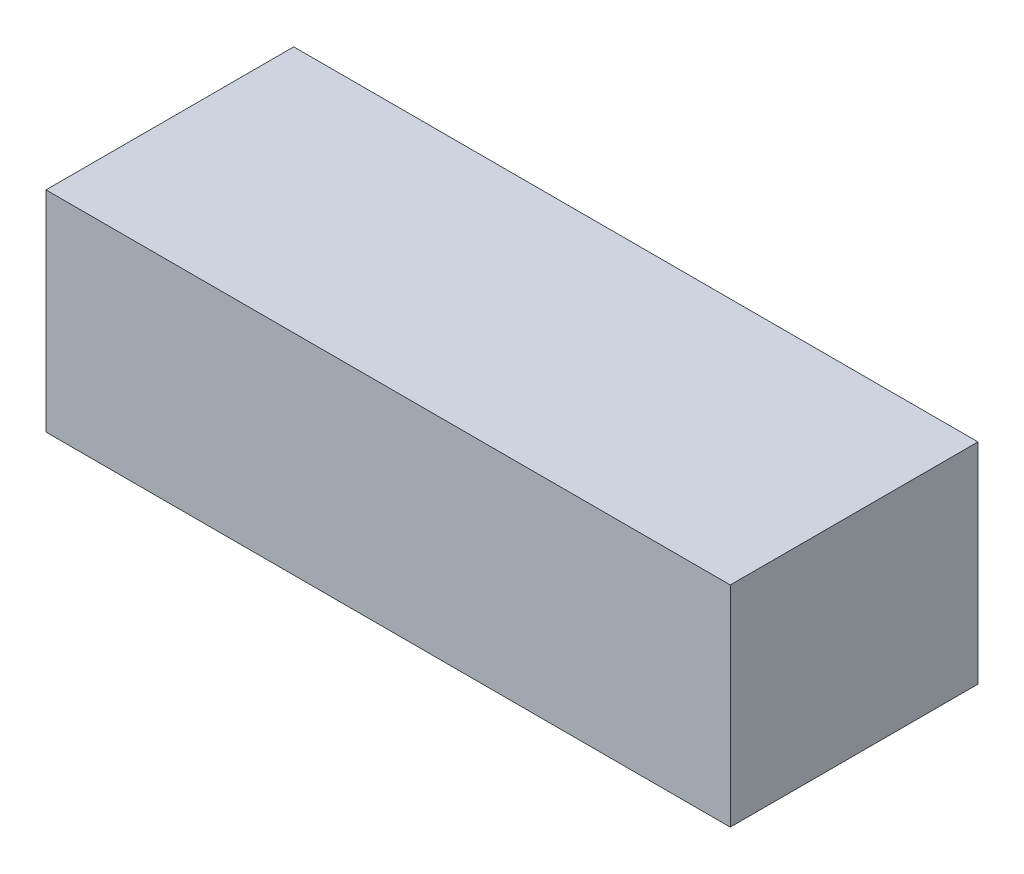
ISO-10303-21;
HEADER;
FILE_DESCRIPTION(('STEP AP214'),'2;1');
FILE_NAME('part.step','',(''),(''),'','','');
FILE_SCHEMA(('AUTOMOTIVE_DESIGN { 1 0 10303 214 1 1 1 1 }'));
ENDSEC;
DATA;
#1=APPLICATION_CONTEXT('core data for automotive mechanical design processes');
#2=APPLICATION_PROTOCOL_DEFINITION('international standard','automotive_design',2000,#1);
#3=PRODUCT_CONTEXT('',#1,'mechanical');
#4=PRODUCT('Part','Part','',(#3));
#5=PRODUCT_RELATED_PRODUCT_CATEGORY('part','',(#4));
#6=PRODUCT_DEFINITION_FORMATION('','',#4);
#7=PRODUCT_DEFINITION_CONTEXT('part definition',#1,'design');
#8=PRODUCT_DEFINITION('design','',#6,#7);
#9=PRODUCT_DEFINITION_SHAPE('','',#8);
#10=(LENGTH_UNIT() NAMED_UNIT(*) SI_UNIT(.MILLI.,.METRE.));
#11=(NAMED_UNIT(*) PLANE_ANGLE_UNIT() SI_UNIT($,.RADIAN.));
#12=(NAMED_UNIT(*) SI_UNIT($,.STERADIAN.) SOLID_ANGLE_UNIT());
#13=UNCERTAINTY_MEASURE_WITH_UNIT(LENGTH_MEASURE(1.E-05),#10,'distance_accuracy_value','');
#14=(GEOMETRIC_REPRESENTATION_CONTEXT(3) GLOBAL_UNCERTAINTY_ASSIGNED_CONTEXT((#13)) GLOBAL_UNIT_ASSIGNED_CONTEXT((#10,
#11,#12)) REPRESENTATION_CONTEXT('',''));
#15=CARTESIAN_POINT('',(0.,0.,0.));
#16=DIRECTION('',(0.,0.,1.));
#17=DIRECTION('',(1.,0.,0.));
#18=AXIS2_PLACEMENT_3D('',#15,#16,#17);
#19=CARTESIAN_POINT('',(-44.6044948453608,8.34630927835053,49.6));
#20=DIRECTION('',(1.,0.,0.));
#21=DIRECTION('',(0.,1.,0.));
#22=AXIS2_PLACEMENT_3D('',#19,#20,#21);
#23=PLANE('',#22);
#24=DIRECTION('',(0.,-1.,0.));
#25=VECTOR('',#24,1.);
#26=CARTESIAN_POINT('',(-44.6044948453608,8.34630927835053,0.));
#27=LINE('',#26,#25);
#28=CARTESIAN_POINT('',(-44.6044948453608,8.34630927835053,0.));
#29=VERTEX_POINT('',#28);
#30=CARTESIAN_POINT('',(-44.6044948453608,-33.6536907216495,0.));
#31=VERTEX_POINT('',#30);
#32=EDGE_CURVE('E109',#29,#31,#27,.T.);
#33=ORIENTED_EDGE('',*,*,#32,.T.);
#34=DIRECTION('',(0.,0.,-1.));
#35=VECTOR('',#34,1.);
#36=CARTESIAN_POINT('',(-44.6044948453608,-33.6536907216495,49.6));
#37=LINE('',#36,#35);
#38=CARTESIAN_POINT('',(-44.6044948453608,-33.6536907216495,49.6));
#39=VERTEX_POINT('',#38);
#40=EDGE_CURVE('E11',#39,#31,#37,.T.);
#41=ORIENTED_EDGE('',*,*,#40,.F.);
#42=DIRECTION('',(0.,-1.,0.));
#43=VECTOR('',#42,1.);
#44=CARTESIAN_POINT('',(-44.6044948453608,8.34630927835053,49.6));
#45=LINE('',#44,#43);
#46=CARTESIAN_POINT('',(-44.6044948453608,8.34630927835053,49.6));
#47=VERTEX_POINT('',#46);
#48=EDGE_CURVE('E93',#47,#39,#45,.T.);
#49=ORIENTED_EDGE('',*,*,#48,.F.);
#50=DIRECTION('',(0.,0.,-1.));
#51=VECTOR('',#50,1.);
#52=CARTESIAN_POINT('',(-44.6044948453608,8.34630927835053,49.6));
#53=LINE('',#52,#51);
#54=EDGE_CURVE('E105',#47,#29,#53,.T.);
#55=ORIENTED_EDGE('',*,*,#54,.T.);
#56=EDGE_LOOP('',(#33,#41,#49,#55));
#57=FACE_BOUND('',#56,.T.);
#58=ADVANCED_FACE('F41',(#57),#23,.F.);
#59=CARTESIAN_POINT('',(-44.6044948453608,-33.6536907216495,49.6));
#60=DIRECTION('',(0.,1.,0.));
#61=DIRECTION('',(0.,0.,1.));
#62=AXIS2_PLACEMENT_3D('',#59,#60,#61);
#63=PLANE('',#62);
#64=DIRECTION('',(1.,0.,0.));
#65=VECTOR('',#64,1.);
#66=CARTESIAN_POINT('',(-44.6044948453608,-33.6536907216495,0.));
#67=LINE('',#66,#65);
#68=CARTESIAN_POINT('',(92.3955051546392,-33.6536907216495,0.));
#69=VERTEX_POINT('',#68);
#70=EDGE_CURVE('E98',#31,#69,#67,.T.);
#71=ORIENTED_EDGE('',*,*,#70,.T.);
#72=DIRECTION('',(0.,0.,-1.));
#73=VECTOR('',#72,1.);
#74=CARTESIAN_POINT('',(92.3955051546392,-33.6536907216495,49.6));
#75=LINE('',#74,#73);
#76=CARTESIAN_POINT('',(92.3955051546392,-33.6536907216495,49.6));
#77=VERTEX_POINT('',#76);
#78=EDGE_CURVE('E50',#77,#69,#75,.T.);
#79=ORIENTED_EDGE('',*,*,#78,.F.);
#80=DIRECTION('',(1.,0.,0.));
#81=VECTOR('',#80,1.);
#82=CARTESIAN_POINT('',(-44.6044948453608,-33.6536907216495,49.6));
#83=LINE('',#82,#81);
#84=EDGE_CURVE('E88',#39,#77,#83,.T.);
#85=ORIENTED_EDGE('',*,*,#84,.F.);
#86=ORIENTED_EDGE('',*,*,#40,.T.);
#87=EDGE_LOOP('',(#71,#79,#85,#86));
#88=FACE_BOUND('',#87,.T.);
#89=ADVANCED_FACE('F97',(#88),#63,.F.);
#90=CARTESIAN_POINT('',(92.3955051546392,8.34630927835053,49.6));
#91=DIRECTION('',(-1.,0.,0.));
#92=DIRECTION('',(0.,-1.,0.));
#93=AXIS2_PLACEMENT_3D('',#90,#91,#92);
#94=PLANE('',#93);
#95=DIRECTION('',(0.,1.,0.));
#96=VECTOR('',#95,1.);
#97=CARTESIAN_POINT('',(92.3955051546392,8.34630927835053,0.));
#98=LINE('',#97,#96);
#99=CARTESIAN_POINT('',(92.3955051546392,8.34630927835053,0.));
#100=VERTEX_POINT('',#99);
#101=EDGE_CURVE('E75',#69,#100,#98,.T.);
#102=ORIENTED_EDGE('',*,*,#101,.T.);
#103=DIRECTION('',(0.,0.,-1.));
#104=VECTOR('',#103,1.);
#105=CARTESIAN_POINT('',(92.3955051546392,8.34630927835053,49.6));
#106=LINE('',#105,#104);
#107=CARTESIAN_POINT('',(92.3955051546392,8.34630927835053,49.6));
#108=VERTEX_POINT('',#107);
#109=EDGE_CURVE('E100',#108,#100,#106,.T.);
#110=ORIENTED_EDGE('',*,*,#109,.F.);
#111=DIRECTION('',(0.,1.,0.));
#112=VECTOR('',#111,1.);
#113=CARTESIAN_POINT('',(92.3955051546392,8.34630927835053,49.6));
#114=LINE('',#113,#112);
#115=EDGE_CURVE('E91',#77,#108,#114,.T.);
#116=ORIENTED_EDGE('',*,*,#115,.F.);
#117=ORIENTED_EDGE('',*,*,#78,.T.);
#118=EDGE_LOOP('',(#102,#110,#116,#117));
#119=FACE_BOUND('',#118,.T.);
#120=ADVANCED_FACE('F101',(#119),#94,.F.);
#121=CARTESIAN_POINT('',(-44.6044948453608,8.34630927835053,49.6));
#122=DIRECTION('',(0.,-1.,0.));
#123=DIRECTION('',(0.,0.,-1.));
#124=AXIS2_PLACEMENT_3D('',#121,#122,#123);
#125=PLANE('',#124);
#126=DIRECTION('',(-1.,0.,0.));
#127=VECTOR('',#126,1.);
#128=CARTESIAN_POINT('',(-44.6044948453608,8.34630927835053,0.));
#129=LINE('',#128,#127);
#130=EDGE_CURVE('E81',#100,#29,#129,.T.);
#131=ORIENTED_EDGE('',*,*,#130,.T.);
#132=ORIENTED_EDGE('',*,*,#54,.F.);
#133=DIRECTION('',(-1.,0.,0.));
#134=VECTOR('',#133,1.);
#135=CARTESIAN_POINT('',(-44.6044948453608,8.34630927835053,49.6));
#136=LINE('',#135,#134);
#137=EDGE_CURVE('E58',#108,#47,#136,.T.);
#138=ORIENTED_EDGE('',*,*,#137,.F.);
#139=ORIENTED_EDGE('',*,*,#109,.T.);
#140=EDGE_LOOP('',(#131,#132,#138,#139));
#141=FACE_BOUND('',#140,.T.);
#142=ADVANCED_FACE('F122',(#141),#125,.F.);
#143=CARTESIAN_POINT('',(0.,0.,49.6));
#144=DIRECTION('',(0.,0.,1.));
#145=DIRECTION('',(1.,0.,0.));
#146=AXIS2_PLACEMENT_3D('',#143,#144,#145);
#147=PLANE('',#146);
#148=ORIENTED_EDGE('',*,*,#48,.T.);
#149=ORIENTED_EDGE('',*,*,#84,.T.);
#150=ORIENTED_EDGE('',*,*,#115,.T.);
#151=ORIENTED_EDGE('',*,*,#137,.T.);
#152=EDGE_LOOP('',(#148,#149,#150,#151));
#153=FACE_BOUND('',#152,.T.);
#154=ADVANCED_FACE('F89',(#153),#147,.T.);
#155=CARTESIAN_POINT('',(0.,0.,0.));
#156=DIRECTION('',(0.,0.,1.));
#157=DIRECTION('',(1.,0.,0.));
#158=AXIS2_PLACEMENT_3D('',#155,#156,#157);
#159=PLANE('',#158);
#160=ORIENTED_EDGE('',*,*,#32,.F.);
#161=ORIENTED_EDGE('',*,*,#130,.F.);
#162=ORIENTED_EDGE('',*,*,#101,.F.);
#163=ORIENTED_EDGE('',*,*,#70,.F.);
#164=EDGE_LOOP('',(#160,#161,#162,#163));
#165=FACE_BOUND('',#164,.T.);
#166=ADVANCED_FACE('F125',(#165),#159,.F.);
#167=CLOSED_SHELL('',(#58,#89,#120,#142,#154,#166));
#168=MANIFOLD_SOLID_BREP('B2',#167);
#169=ADVANCED_BREP_SHAPE_REPRESENTATION('',(#18,#168),#14);
#170=SHAPE_DEFINITION_REPRESENTATION(#9,#169);
ENDSEC;
END-ISO-10303-21;
